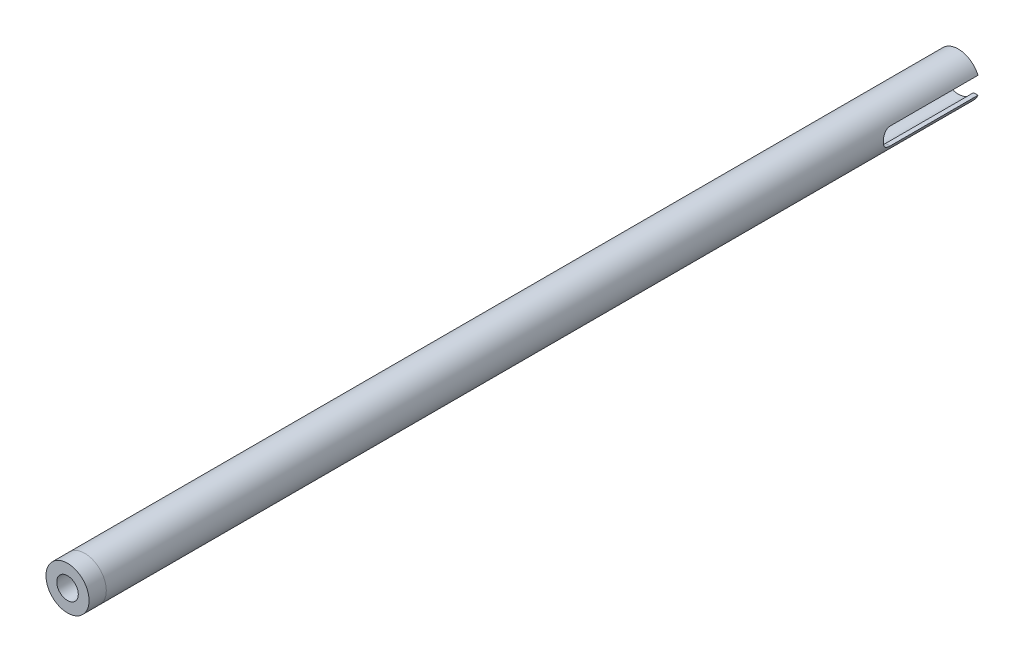
ISO-10303-21;
HEADER;
FILE_DESCRIPTION(('STEP AP214'),'2;1');
FILE_NAME('part.step','',(''),(''),'','','');
FILE_SCHEMA(('AUTOMOTIVE_DESIGN { 1 0 10303 214 1 1 1 1 }'));
ENDSEC;
DATA;
#1=APPLICATION_CONTEXT('core data for automotive mechanical design processes');
#2=APPLICATION_PROTOCOL_DEFINITION('international standard','automotive_design',2000,#1);
#3=PRODUCT_CONTEXT('',#1,'mechanical');
#4=PRODUCT('Part','Part','',(#3));
#5=PRODUCT_RELATED_PRODUCT_CATEGORY('part','',(#4));
#6=PRODUCT_DEFINITION_FORMATION('','',#4);
#7=PRODUCT_DEFINITION_CONTEXT('part definition',#1,'design');
#8=PRODUCT_DEFINITION('design','',#6,#7);
#9=PRODUCT_DEFINITION_SHAPE('','',#8);
#10=(LENGTH_UNIT() NAMED_UNIT(*) SI_UNIT(.MILLI.,.METRE.));
#11=(NAMED_UNIT(*) PLANE_ANGLE_UNIT() SI_UNIT($,.RADIAN.));
#12=(NAMED_UNIT(*) SI_UNIT($,.STERADIAN.) SOLID_ANGLE_UNIT());
#13=UNCERTAINTY_MEASURE_WITH_UNIT(LENGTH_MEASURE(1.E-05),#10,'distance_accuracy_value','');
#14=(GEOMETRIC_REPRESENTATION_CONTEXT(3) GLOBAL_UNCERTAINTY_ASSIGNED_CONTEXT((#13)) GLOBAL_UNIT_ASSIGNED_CONTEXT((#10,
#11,#12)) REPRESENTATION_CONTEXT('',''));
#15=CARTESIAN_POINT('',(0.,0.,0.));
#16=DIRECTION('',(0.,0.,1.));
#17=DIRECTION('',(1.,0.,0.));
#18=AXIS2_PLACEMENT_3D('',#15,#16,#17);
#19=CARTESIAN_POINT('',(0.,0.,-328.070249741066));
#20=DIRECTION('',(0.,0.,1.));
#21=DIRECTION('',(1.,0.,0.));
#22=AXIS2_PLACEMENT_3D('',#19,#20,#21);
#23=CYLINDRICAL_SURFACE('',#22,7.9375);
#24=CARTESIAN_POINT('',(0.,0.,-6.35));
#25=DIRECTION('',(0.,0.,1.));
#26=DIRECTION('',(1.,0.,0.));
#27=AXIS2_PLACEMENT_3D('',#24,#25,#26);
#28=CIRCLE('',#27,7.9375);
#29=CARTESIAN_POINT('',(7.9375,0.,-6.35));
#30=VERTEX_POINT('',#29);
#31=EDGE_CURVE('E167',#30,#30,#28,.T.);
#32=ORIENTED_EDGE('',*,*,#31,.F.);
#33=EDGE_LOOP('',(#32));
#34=FACE_BOUND('',#33,.T.);
#35=CARTESIAN_POINT('',(-7.2748389157424,3.175,-295.685249741066));
#36=CARTESIAN_POINT('',(-7.27482137043434,3.17501267173453,-295.599829625584));
#37=CARTESIAN_POINT('',(-7.27634297592672,3.17155313247793,-295.514419096021));
#38=CARTESIAN_POINT('',(-7.28233338484875,3.15778866907725,-295.344287091693));
#39=CARTESIAN_POINT('',(-7.28680106535325,3.14748635311323,-295.259565366834));
#40=CARTESIAN_POINT('',(-7.29852916312671,3.12019002880162,-295.091751667025));
#41=CARTESIAN_POINT('',(-7.30577831906487,3.10322299732751,-295.008654522266));
#42=CARTESIAN_POINT('',(-7.32282161153745,3.06278779397034,-294.844343420241));
#43=CARTESIAN_POINT('',(-7.33261590324725,3.03931922568674,-294.763129578127));
#44=CARTESIAN_POINT('',(-7.36535331460444,2.95952924342962,-294.523304755545));
#45=CARTESIAN_POINT('',(-7.39167595677839,2.89376893609239,-294.368179826741));
#46=CARTESIAN_POINT('',(-7.45033259991547,2.73920602658923,-294.07109240003));
#47=CARTESIAN_POINT('',(-7.48267254395243,2.65038060922872,-293.929143124812));
#48=CARTESIAN_POINT('',(-7.55175295441386,2.44684429809695,-293.654422355292));
#49=CARTESIAN_POINT('',(-7.58863404630154,2.33103943595689,-293.52249497078));
#50=CARTESIAN_POINT('',(-7.66147718953598,2.07914562663536,-293.279332087148));
#51=CARTESIAN_POINT('',(-7.69743902899202,1.94305205135848,-293.168101322221));
#52=CARTESIAN_POINT('',(-7.76611692840651,1.6477828266442,-292.965180122725));
#53=CARTESIAN_POINT('',(-7.79864638434712,1.48790317306357,-292.874445711321));
#54=CARTESIAN_POINT('',(-7.85502980346525,1.15369615984565,-292.721588157904));
#55=CARTESIAN_POINT('',(-7.87889360585224,0.979385463602728,-292.659432545287));
#56=CARTESIAN_POINT('',(-7.91022225039827,0.670405323433351,-292.578920901631));
#57=CARTESIAN_POINT('',(-7.92038443902171,0.537888188660434,-292.553242978221));
#58=CARTESIAN_POINT('',(-7.93061686811603,0.337231082382101,-292.52748789514));
#59=CARTESIAN_POINT('',(-7.93319257341971,0.269991647180293,-292.521029797859));
#60=CARTESIAN_POINT('',(-7.93663621925193,0.135173873369594,-292.512408780107));
#61=CARTESIAN_POINT('',(-7.93750363389236,0.0675954368175856,-292.510247182289));
#62=CARTESIAN_POINT('',(-7.9375,0.,-292.510249741066));
#63=B_SPLINE_CURVE_WITH_KNOTS('',3,(#35,#36,#37,#38,#39,#40,#41,#42,#43,#44,#45,#46,#47,#48,#49,
#50,#51,#52,#53,#54,#55,#56,#57,#58,#59,#60,#61,#62),.UNSPECIFIED.,.F.,.F.,(4,2,2,2,2,2,2,2,2,2,
2,2,2,4),(0.,0.256160797396612,0.512224013007114,0.767261264672295,1.02231406945471,
1.53142416248594,2.04103978047897,2.57679273649398,3.11266809162683,3.6699113602974,
4.22651992730645,4.63134321412667,4.8339937586662,5.03670667834028),.UNSPECIFIED.);
#64=CARTESIAN_POINT('',(-7.2748389157424,3.175,-295.685249741066));
#65=VERTEX_POINT('',#64);
#66=CARTESIAN_POINT('',(-7.9375,0.,-292.510249741066));
#67=VERTEX_POINT('',#66);
#68=EDGE_CURVE('E194',#65,#67,#63,.T.);
#69=ORIENTED_EDGE('',*,*,#68,.T.);
#70=CARTESIAN_POINT('',(-7.9375,0.,-292.510249741066));
#71=CARTESIAN_POINT('',(-7.93751279435796,-0.0856973243893184,-292.510237710897));
#72=CARTESIAN_POINT('',(-7.93611246860092,-0.171386675169292,-292.513719078369));
#73=CARTESIAN_POINT('',(-7.93058107051394,-0.342092796869088,-292.527575173704));
#74=CARTESIAN_POINT('',(-7.92645080745519,-0.427109759557718,-292.537947858687));
#75=CARTESIAN_POINT('',(-7.91557399086504,-0.595570690948314,-292.565445052755));
#76=CARTESIAN_POINT('',(-7.90883664469869,-0.679019123580001,-292.582545804028));
#77=CARTESIAN_POINT('',(-7.89293284658536,-0.844038966454637,-292.623313051501));
#78=CARTESIAN_POINT('',(-7.88376629739099,-0.925610301410299,-292.646979810558));
#79=CARTESIAN_POINT('',(-7.8529700783248,-1.16656173687588,-292.727487466256));
#80=CARTESIAN_POINT('',(-7.82802544143957,-1.3224472028299,-292.793880099133));
#81=CARTESIAN_POINT('',(-7.77174407779742,-1.62081902572889,-292.949925503126));
#82=CARTESIAN_POINT('',(-7.74040257287306,-1.76329524966531,-293.039595675189));
#83=CARTESIAN_POINT('',(-7.67287736621953,-2.03755465224644,-293.244049282705));
#84=CARTESIAN_POINT('',(-7.63654472176442,-2.16862853615059,-293.359736139436));
#85=CARTESIAN_POINT('',(-7.56380976030912,-2.4101102261282,-293.611030241145));
#86=CARTESIAN_POINT('',(-7.52740741976911,-2.52050895891189,-293.746646185628));
#87=CARTESIAN_POINT('',(-7.45683282624283,-2.72240939900243,-294.041344680494));
#88=CARTESIAN_POINT('',(-7.4228346735038,-2.81283701743191,-294.201208670409));
#89=CARTESIAN_POINT('',(-7.36333622196319,-2.96511894168389,-294.535334635206));
#90=CARTESIAN_POINT('',(-7.33782422493328,-3.02701262758154,-294.709576372965));
#91=CARTESIAN_POINT('',(-7.30424985403508,-3.10695047193342,-295.017880097616));
#92=CARTESIAN_POINT('',(-7.29331360019113,-3.13238569878909,-295.149738858502));
#93=CARTESIAN_POINT('',(-7.28227977674291,-3.15790858319,-295.349455740196));
#94=CARTESIAN_POINT('',(-7.27949685702346,-3.16431127275806,-295.416404030956));
#95=CARTESIAN_POINT('',(-7.27577355567174,-3.17285909036155,-295.550645588822));
#96=CARTESIAN_POINT('',(-7.27483380475762,-3.1750027609968,-295.61793896612));
#97=CARTESIAN_POINT('',(-7.2748389157424,-3.175,-295.685249741066));
#98=B_SPLINE_CURVE_WITH_KNOTS('',3,(#70,#71,#72,#73,#74,#75,#76,#77,#78,#79,#80,#81,#82,#83,#84,
#85,#86,#87,#88,#89,#90,#91,#92,#93,#94,#95,#96,#97),.UNSPECIFIED.,.F.,.F.,(4,2,2,2,2,2,2,2,2,2,
2,2,2,4),(0.,0.256996432008007,0.513916713336978,0.769937797705373,1.02596913282157,
1.53722547809955,2.04886511530059,2.58219314099272,3.11575467201799,3.67332953074268,
4.2301325519037,4.63306130520176,4.8348500382744,5.03670780985613),.UNSPECIFIED.);
#99=CARTESIAN_POINT('',(-7.2748389157424,-3.175,-295.685249741066));
#100=VERTEX_POINT('',#99);
#101=EDGE_CURVE('E146',#67,#100,#98,.T.);
#102=ORIENTED_EDGE('',*,*,#101,.T.);
#103=DIRECTION('',(0.,0.,-1.));
#104=VECTOR('',#103,1.);
#105=CARTESIAN_POINT('',(-7.2748389157424,-3.175,-292.510249741066));
#106=LINE('',#105,#104);
#107=CARTESIAN_POINT('',(-7.2748389157424,-3.175,-328.070249741066));
#108=VERTEX_POINT('',#107);
#109=EDGE_CURVE('E141',#100,#108,#106,.T.);
#110=ORIENTED_EDGE('',*,*,#109,.T.);
#111=CARTESIAN_POINT('',(0.,0.,-328.070249741066));
#112=DIRECTION('',(0.,0.,1.));
#113=DIRECTION('',(1.,0.,0.));
#114=AXIS2_PLACEMENT_3D('',#111,#112,#113);
#115=CIRCLE('',#114,7.9375);
#116=CARTESIAN_POINT('',(7.2748389157424,-3.175,-328.070249741066));
#117=VERTEX_POINT('',#116);
#118=EDGE_CURVE('E144',#108,#117,#115,.T.);
#119=ORIENTED_EDGE('',*,*,#118,.T.);
#120=DIRECTION('',(0.,0.,-1.));
#121=VECTOR('',#120,1.);
#122=CARTESIAN_POINT('',(7.2748389157424,-3.175,-292.510249741066));
#123=LINE('',#122,#121);
#124=CARTESIAN_POINT('',(7.2748389157424,-3.175,-295.685249741066));
#125=VERTEX_POINT('',#124);
#126=EDGE_CURVE('E427',#125,#117,#123,.T.);
#127=ORIENTED_EDGE('',*,*,#126,.F.);
#128=CARTESIAN_POINT('',(7.2748389157424,-3.175,-295.685249741066));
#129=CARTESIAN_POINT('',(7.27482137043434,-3.17501267173453,-295.599829625584));
#130=CARTESIAN_POINT('',(7.27634297592672,-3.17155313247793,-295.514419096021));
#131=CARTESIAN_POINT('',(7.28233338484875,-3.15778866907725,-295.344287091693));
#132=CARTESIAN_POINT('',(7.28680106535325,-3.14748635311323,-295.259565366834));
#133=CARTESIAN_POINT('',(7.29852916312671,-3.12019002880162,-295.091751667025));
#134=CARTESIAN_POINT('',(7.30577831906487,-3.10322299732751,-295.008654522266));
#135=CARTESIAN_POINT('',(7.32282161153745,-3.06278779397034,-294.844343420241));
#136=CARTESIAN_POINT('',(7.33261590324725,-3.03931922568674,-294.763129578127));
#137=CARTESIAN_POINT('',(7.36535331460444,-2.95952924342962,-294.523304755545));
#138=CARTESIAN_POINT('',(7.39167595677839,-2.89376893609239,-294.368179826741));
#139=CARTESIAN_POINT('',(7.45033259991547,-2.73920602658923,-294.07109240003));
#140=CARTESIAN_POINT('',(7.48267254395243,-2.65038060922872,-293.929143124812));
#141=CARTESIAN_POINT('',(7.55175295441386,-2.44684429809695,-293.654422355292));
#142=CARTESIAN_POINT('',(7.58863404630154,-2.33103943595689,-293.52249497078));
#143=CARTESIAN_POINT('',(7.66147718953598,-2.07914562663536,-293.279332087148));
#144=CARTESIAN_POINT('',(7.69743902899202,-1.94305205135848,-293.168101322221));
#145=CARTESIAN_POINT('',(7.76611692840651,-1.6477828266442,-292.965180122725));
#146=CARTESIAN_POINT('',(7.79864638434712,-1.48790317306357,-292.874445711321));
#147=CARTESIAN_POINT('',(7.85502980346525,-1.15369615984565,-292.721588157904));
#148=CARTESIAN_POINT('',(7.87889360585224,-0.979385463602728,-292.659432545287));
#149=CARTESIAN_POINT('',(7.91022225039827,-0.670405323433351,-292.578920901631));
#150=CARTESIAN_POINT('',(7.92038443902171,-0.537888188660434,-292.553242978221));
#151=CARTESIAN_POINT('',(7.93061686811603,-0.337231082382101,-292.52748789514));
#152=CARTESIAN_POINT('',(7.93319257341971,-0.269991647180293,-292.521029797859));
#153=CARTESIAN_POINT('',(7.93663621925193,-0.135173873369594,-292.512408780107));
#154=CARTESIAN_POINT('',(7.93750363389236,-0.0675954368175856,-292.510247182289));
#155=CARTESIAN_POINT('',(7.9375,0.,-292.510249741066));
#156=B_SPLINE_CURVE_WITH_KNOTS('',3,(#128,#129,#130,#131,#132,#133,#134,#135,#136,#137,#138,
#139,#140,#141,#142,#143,#144,#145,#146,#147,#148,#149,#150,#151,#152,#153,#154,#155),
.UNSPECIFIED.,.F.,.F.,(4,2,2,2,2,2,2,2,2,2,2,2,2,4),(0.,0.256160797396612,0.512224013007114,
0.767261264672295,1.02231406945471,1.53142416248594,2.04103978047897,2.57679273649398,
3.11266809162683,3.6699113602974,4.22651992730645,4.63134321412667,4.8339937586662,
5.03670667834028),.UNSPECIFIED.);
#157=CARTESIAN_POINT('',(7.9375,0.,-292.510249741066));
#158=VERTEX_POINT('',#157);
#159=EDGE_CURVE('E87',#125,#158,#156,.T.);
#160=ORIENTED_EDGE('',*,*,#159,.T.);
#161=CARTESIAN_POINT('',(7.9375,0.,-292.510249741066));
#162=CARTESIAN_POINT('',(7.93751279435796,0.0856973243893184,-292.510237710897));
#163=CARTESIAN_POINT('',(7.93611246860092,0.171386675169292,-292.513719078369));
#164=CARTESIAN_POINT('',(7.93058107051394,0.342092796869088,-292.527575173704));
#165=CARTESIAN_POINT('',(7.92645080745519,0.427109759557718,-292.537947858687));
#166=CARTESIAN_POINT('',(7.91557399086504,0.595570690948314,-292.565445052755));
#167=CARTESIAN_POINT('',(7.90883664469869,0.679019123580001,-292.582545804028));
#168=CARTESIAN_POINT('',(7.89293284658536,0.844038966454637,-292.623313051501));
#169=CARTESIAN_POINT('',(7.88376629739099,0.925610301410299,-292.646979810558));
#170=CARTESIAN_POINT('',(7.8529700783248,1.16656173687588,-292.727487466256));
#171=CARTESIAN_POINT('',(7.82802544143957,1.3224472028299,-292.793880099133));
#172=CARTESIAN_POINT('',(7.77174407779742,1.62081902572889,-292.949925503126));
#173=CARTESIAN_POINT('',(7.74040257287306,1.76329524966531,-293.039595675189));
#174=CARTESIAN_POINT('',(7.67287736621953,2.03755465224644,-293.244049282705));
#175=CARTESIAN_POINT('',(7.63654472176442,2.16862853615059,-293.359736139436));
#176=CARTESIAN_POINT('',(7.56380976030912,2.4101102261282,-293.611030241145));
#177=CARTESIAN_POINT('',(7.52740741976911,2.52050895891189,-293.746646185628));
#178=CARTESIAN_POINT('',(7.45683282624283,2.72240939900243,-294.041344680494));
#179=CARTESIAN_POINT('',(7.4228346735038,2.81283701743191,-294.201208670409));
#180=CARTESIAN_POINT('',(7.36333622196319,2.96511894168389,-294.535334635206));
#181=CARTESIAN_POINT('',(7.33782422493328,3.02701262758154,-294.709576372965));
#182=CARTESIAN_POINT('',(7.30424985403508,3.10695047193342,-295.017880097616));
#183=CARTESIAN_POINT('',(7.29331360019113,3.13238569878909,-295.149738858502));
#184=CARTESIAN_POINT('',(7.28227977674291,3.15790858319,-295.349455740196));
#185=CARTESIAN_POINT('',(7.27949685702346,3.16431127275806,-295.416404030956));
#186=CARTESIAN_POINT('',(7.27577355567174,3.17285909036155,-295.550645588822));
#187=CARTESIAN_POINT('',(7.27483380475762,3.1750027609968,-295.61793896612));
#188=CARTESIAN_POINT('',(7.2748389157424,3.175,-295.685249741066));
#189=B_SPLINE_CURVE_WITH_KNOTS('',3,(#161,#162,#163,#164,#165,#166,#167,#168,#169,#170,#171,
#172,#173,#174,#175,#176,#177,#178,#179,#180,#181,#182,#183,#184,#185,#186,#187,#188),
.UNSPECIFIED.,.F.,.F.,(4,2,2,2,2,2,2,2,2,2,2,2,2,4),(0.,0.256996432008007,0.513916713336978,
0.769937797705373,1.02596913282157,1.53722547809955,2.04886511530059,2.58219314099272,
3.11575467201799,3.67332953074268,4.2301325519037,4.63306130520176,4.8348500382744,
5.03670780985613),.UNSPECIFIED.);
#190=CARTESIAN_POINT('',(7.2748389157424,3.175,-295.685249741066));
#191=VERTEX_POINT('',#190);
#192=EDGE_CURVE('E73',#158,#191,#189,.T.);
#193=ORIENTED_EDGE('',*,*,#192,.T.);
#194=DIRECTION('',(0.,0.,-1.));
#195=VECTOR('',#194,1.);
#196=CARTESIAN_POINT('',(7.2748389157424,3.175,-292.510249741066));
#197=LINE('',#196,#195);
#198=CARTESIAN_POINT('',(7.2748389157424,3.175,-328.070249741066));
#199=VERTEX_POINT('',#198);
#200=EDGE_CURVE('E160',#191,#199,#197,.T.);
#201=ORIENTED_EDGE('',*,*,#200,.T.);
#202=CARTESIAN_POINT('',(-7.2748389157424,3.175,-328.070249741066));
#203=VERTEX_POINT('',#202);
#204=EDGE_CURVE('E166',#199,#203,#115,.T.);
#205=ORIENTED_EDGE('',*,*,#204,.T.);
#206=DIRECTION('',(0.,0.,-1.));
#207=VECTOR('',#206,1.);
#208=CARTESIAN_POINT('',(-7.2748389157424,3.175,-292.510249741066));
#209=LINE('',#208,#207);
#210=EDGE_CURVE('E420',#65,#203,#209,.T.);
#211=ORIENTED_EDGE('',*,*,#210,.F.);
#212=EDGE_LOOP('',(#69,#102,#110,#119,#127,#160,#193,#201,#205,#211));
#213=FACE_BOUND('',#212,.T.);
#214=ADVANCED_FACE('F63',(#34,#213),#23,.T.);
#215=CARTESIAN_POINT('',(0.,0.,-328.070249741066));
#216=DIRECTION('',(0.,0.,1.));
#217=DIRECTION('',(1.,0.,0.));
#218=AXIS2_PLACEMENT_3D('',#215,#216,#217);
#219=PLANE('',#218);
#220=DIRECTION('',(1.,0.,0.));
#221=VECTOR('',#220,1.);
#222=CARTESIAN_POINT('',(0.,-3.175,-328.070249741066));
#223=LINE('',#222,#221);
#224=CARTESIAN_POINT('',(-5.63085690548073,-3.175,-328.070249741066));
#225=VERTEX_POINT('',#224);
#226=EDGE_CURVE('E153',#108,#225,#223,.T.);
#227=ORIENTED_EDGE('',*,*,#226,.T.);
#228=CARTESIAN_POINT('',(0.,0.,-328.070249741066));
#229=DIRECTION('',(0.,0.,1.));
#230=DIRECTION('',(1.,0.,0.));
#231=AXIS2_PLACEMENT_3D('',#228,#229,#230);
#232=CIRCLE('',#231,6.4643);
#233=CARTESIAN_POINT('',(5.63085690548073,-3.175,-328.070249741066));
#234=VERTEX_POINT('',#233);
#235=EDGE_CURVE('E275',#225,#234,#232,.T.);
#236=ORIENTED_EDGE('',*,*,#235,.T.);
#237=DIRECTION('',(1.,0.,0.));
#238=VECTOR('',#237,1.);
#239=CARTESIAN_POINT('',(0.,-3.175,-328.070249741066));
#240=LINE('',#239,#238);
#241=EDGE_CURVE('E165',#234,#117,#240,.T.);
#242=ORIENTED_EDGE('',*,*,#241,.T.);
#243=ORIENTED_EDGE('',*,*,#118,.F.);
#244=EDGE_LOOP('',(#227,#236,#242,#243));
#245=FACE_BOUND('',#244,.T.);
#246=ADVANCED_FACE('F163',(#245),#219,.F.);
#247=CARTESIAN_POINT('',(0.,0.,-328.070249741066));
#248=DIRECTION('',(0.,0.,1.));
#249=DIRECTION('',(1.,0.,0.));
#250=AXIS2_PLACEMENT_3D('',#247,#248,#249);
#251=CYLINDRICAL_SURFACE('',#250,6.4643);
#252=CARTESIAN_POINT('',(0.,0.,-6.35));
#253=DIRECTION('',(0.,0.,1.));
#254=DIRECTION('',(1.,0.,0.));
#255=AXIS2_PLACEMENT_3D('',#252,#253,#254);
#256=CIRCLE('',#255,6.4643);
#257=CARTESIAN_POINT('',(6.4643,0.,-6.35));
#258=VERTEX_POINT('',#257);
#259=EDGE_CURVE('E149',#258,#258,#256,.T.);
#260=ORIENTED_EDGE('',*,*,#259,.T.);
#261=EDGE_LOOP('',(#260));
#262=FACE_BOUND('',#261,.T.);
#263=DIRECTION('',(0.,0.,-1.));
#264=VECTOR('',#263,1.);
#265=CARTESIAN_POINT('',(-5.63085690548073,-3.175,-292.510249741066));
#266=LINE('',#265,#264);
#267=CARTESIAN_POINT('',(-5.63085690548073,-3.175,-295.685249741066));
#268=VERTEX_POINT('',#267);
#269=EDGE_CURVE('E150',#268,#225,#266,.T.);
#270=ORIENTED_EDGE('',*,*,#269,.F.);
#271=CARTESIAN_POINT('',(-5.63085690548073,-3.175,-295.685249741066));
#272=CARTESIAN_POINT('',(-5.63083313994649,-3.17501475983035,-295.601872906346));
#273=CARTESIAN_POINT('',(-5.63270815771784,-3.17171623434453,-295.518509231177));
#274=CARTESIAN_POINT('',(-5.64007695954704,-3.15860868668088,-295.352504089081));
#275=CARTESIAN_POINT('',(-5.64556860910801,-3.14880350463521,-295.269862225282));
#276=CARTESIAN_POINT('',(-5.6599516035627,-3.12287177657853,-295.106358960612));
#277=CARTESIAN_POINT('',(-5.6688236064135,-3.10678118209034,-295.025490148432));
#278=CARTESIAN_POINT('',(-5.6896425308495,-3.06848763641646,-294.865632768705));
#279=CARTESIAN_POINT('',(-5.70158978762268,-3.04628401892209,-294.786644407145));
#280=CARTESIAN_POINT('',(-5.74141867016874,-2.9709479042579,-294.553586161184));
#281=CARTESIAN_POINT('',(-5.77333273238342,-2.90901346570841,-294.40294962055));
#282=CARTESIAN_POINT('',(-5.84425759514897,-2.763754188191,-294.114094515716));
#283=CARTESIAN_POINT('',(-5.88327925344641,-2.68039654138926,-293.975895440652));
#284=CARTESIAN_POINT('',(-5.96775435279506,-2.48697819565356,-293.703954402413));
#285=CARTESIAN_POINT('',(-6.01347229172613,-2.37533204038059,-293.571419596064));
#286=CARTESIAN_POINT('',(-6.1040459306363,-2.13182339161098,-293.326044012986));
#287=CARTESIAN_POINT('',(-6.14890136897124,-1.9999548691305,-293.213209131008));
#288=CARTESIAN_POINT('',(-6.23619220514827,-1.70925564842441,-293.003225747087));
#289=CARTESIAN_POINT('',(-6.27828027392068,-1.54922894444793,-292.907575471358));
#290=CARTESIAN_POINT('',(-6.351789494002,-1.21302302470908,-292.745191566141));
#291=CARTESIAN_POINT('',(-6.3832266631188,-1.03686857473503,-292.678414472337));
#292=CARTESIAN_POINT('',(-6.42590822780063,-0.717171909263576,-292.588981825029));
#293=CARTESIAN_POINT('',(-6.4401838278065,-0.575906031157532,-292.559593580107));
#294=CARTESIAN_POINT('',(-6.45458743188517,-0.361448476439112,-292.530060860445));
#295=CARTESIAN_POINT('',(-6.45822048728408,-0.289432204318667,-292.522641415684));
#296=CARTESIAN_POINT('',(-6.46308007773031,-0.14495205029204,-292.512732943524));
#297=CARTESIAN_POINT('',(-6.46430565210199,-0.0724880012715136,-292.510245884329));
#298=CARTESIAN_POINT('',(-6.4643,0.,-292.510249741066));
#299=B_SPLINE_CURVE_WITH_KNOTS('',3,(#271,#272,#273,#274,#275,#276,#277,#278,#279,#280,#281,
#282,#283,#284,#285,#286,#287,#288,#289,#290,#291,#292,#293,#294,#295,#296,#297,#298),
.UNSPECIFIED.,.F.,.F.,(4,2,2,2,2,2,2,2,2,2,2,2,2,4),(0.,0.250022608278555,0.499897788004003,
0.748364171658997,0.996857648438736,1.49241740389683,1.98874063697391,2.52413245916952,
3.05968421153491,3.63008006190818,4.19961425046545,4.63293550793411,4.85021333970384,
5.06757785591817),.UNSPECIFIED.);
#300=CARTESIAN_POINT('',(-6.4643,0.,-292.510249741066));
#301=VERTEX_POINT('',#300);
#302=EDGE_CURVE('E221',#268,#301,#299,.T.);
#303=ORIENTED_EDGE('',*,*,#302,.T.);
#304=CARTESIAN_POINT('',(-6.4643,0.,-292.510249741066));
#305=CARTESIAN_POINT('',(-6.46431471784482,0.0839947643435512,-292.51023639694));
#306=CARTESIAN_POINT('',(-6.46266329267846,0.1679801280104,-292.513582496309));
#307=CARTESIAN_POINT('',(-6.45613851930725,0.33526707084789,-292.526889949912));
#308=CARTESIAN_POINT('',(-6.45126643524264,0.418568905327652,-292.53684870862));
#309=CARTESIAN_POINT('',(-6.4384393661228,0.583520093709594,-292.563218751089));
#310=CARTESIAN_POINT('',(-6.43049830091841,0.66517518191479,-292.579600905337));
#311=CARTESIAN_POINT('',(-6.41174605062734,0.826621713408843,-292.618618445091));
#312=CARTESIAN_POINT('',(-6.40093469346324,0.906413044651109,-292.641254205511));
#313=CARTESIAN_POINT('',(-6.3645999533627,1.14200454475575,-292.718153769603));
#314=CARTESIAN_POINT('',(-6.33514826225986,1.29435730209624,-292.781464402786));
#315=CARTESIAN_POINT('',(-6.26847721301059,1.58615012370468,-292.929955902616));
#316=CARTESIAN_POINT('',(-6.23125016174678,1.72557720024459,-293.015158448982));
#317=CARTESIAN_POINT('',(-6.14993667819984,1.99664965861334,-293.210672395111));
#318=CARTESIAN_POINT('',(-6.10557667432165,2.12736555519216,-293.322159254762));
#319=CARTESIAN_POINT('',(-6.01591119010694,2.36910305567937,-293.564561677944));
#320=CARTESIAN_POINT('',(-5.97060501254448,2.48010951928959,-293.69549203693));
#321=CARTESIAN_POINT('',(-5.88028635793905,2.68759195973765,-293.984814375673));
#322=CARTESIAN_POINT('',(-5.83554983812279,2.78235777578918,-294.144528478326));
#323=CARTESIAN_POINT('',(-5.75613746809778,2.94315382396594,-294.479879722902));
#324=CARTESIAN_POINT('',(-5.72144095718824,3.00924320962384,-294.655483174756));
#325=CARTESIAN_POINT('',(-5.67404956693615,3.09744900867388,-294.973487476442));
#326=CARTESIAN_POINT('',(-5.65804978215016,3.1263652160224,-295.113512166384));
#327=CARTESIAN_POINT('',(-5.64184153899281,3.1554574998571,-295.326260464995));
#328=CARTESIAN_POINT('',(-5.63773701667687,3.16277482388529,-295.397770353099));
#329=CARTESIAN_POINT('',(-5.63223913004552,3.17254960488947,-295.54126141487));
#330=CARTESIAN_POINT('',(-5.6308471601211,3.17500456237039,-295.613242811851));
#331=CARTESIAN_POINT('',(-5.63085690548073,3.175,-295.685249741066));
#332=B_SPLINE_CURVE_WITH_KNOTS('',3,(#304,#305,#306,#307,#308,#309,#310,#311,#312,#313,#314,
#315,#316,#317,#318,#319,#320,#321,#322,#323,#324,#325,#326,#327,#328,#329,#330,#331),
.UNSPECIFIED.,.F.,.F.,(4,2,2,2,2,2,2,2,2,2,2,2,2,4),(0.,0.25188580168802,0.503672794384377,
0.754330922106993,1.00500408047846,1.50534146760877,2.00617626510683,2.53624961383844,
3.06672840649523,3.63692439554961,4.20593853113138,4.63586569132649,4.85167139809479,
5.06758801082739),.UNSPECIFIED.);
#333=CARTESIAN_POINT('',(-5.63085690548073,3.175,-295.685249741066));
#334=VERTEX_POINT('',#333);
#335=EDGE_CURVE('E186',#301,#334,#332,.T.);
#336=ORIENTED_EDGE('',*,*,#335,.T.);
#337=DIRECTION('',(0.,0.,-1.));
#338=VECTOR('',#337,1.);
#339=CARTESIAN_POINT('',(-5.63085690548073,3.175,-292.510249741066));
#340=LINE('',#339,#338);
#341=CARTESIAN_POINT('',(-5.63085690548073,3.175,-328.070249741066));
#342=VERTEX_POINT('',#341);
#343=EDGE_CURVE('E417',#334,#342,#340,.T.);
#344=ORIENTED_EDGE('',*,*,#343,.T.);
#345=CARTESIAN_POINT('',(5.63085690548073,3.175,-328.070249741066));
#346=VERTEX_POINT('',#345);
#347=EDGE_CURVE('E172',#346,#342,#232,.T.);
#348=ORIENTED_EDGE('',*,*,#347,.F.);
#349=DIRECTION('',(0.,0.,-1.));
#350=VECTOR('',#349,1.);
#351=CARTESIAN_POINT('',(5.63085690548073,3.175,-292.510249741066));
#352=LINE('',#351,#350);
#353=CARTESIAN_POINT('',(5.63085690548073,3.175,-295.685249741066));
#354=VERTEX_POINT('',#353);
#355=EDGE_CURVE('E269',#354,#346,#352,.T.);
#356=ORIENTED_EDGE('',*,*,#355,.F.);
#357=CARTESIAN_POINT('',(5.63085690548073,3.175,-295.685249741066));
#358=CARTESIAN_POINT('',(5.63083313994649,3.17501475983035,-295.601872906346));
#359=CARTESIAN_POINT('',(5.63270815771784,3.17171623434453,-295.518509231177));
#360=CARTESIAN_POINT('',(5.64007695954704,3.15860868668088,-295.352504089081));
#361=CARTESIAN_POINT('',(5.64556860910801,3.14880350463521,-295.269862225282));
#362=CARTESIAN_POINT('',(5.6599516035627,3.12287177657853,-295.106358960612));
#363=CARTESIAN_POINT('',(5.6688236064135,3.10678118209034,-295.025490148432));
#364=CARTESIAN_POINT('',(5.6896425308495,3.06848763641646,-294.865632768705));
#365=CARTESIAN_POINT('',(5.70158978762268,3.04628401892209,-294.786644407145));
#366=CARTESIAN_POINT('',(5.74141867016874,2.9709479042579,-294.553586161184));
#367=CARTESIAN_POINT('',(5.77333273238342,2.90901346570841,-294.40294962055));
#368=CARTESIAN_POINT('',(5.84425759514897,2.763754188191,-294.114094515716));
#369=CARTESIAN_POINT('',(5.88327925344641,2.68039654138926,-293.975895440652));
#370=CARTESIAN_POINT('',(5.96775435279506,2.48697819565356,-293.703954402413));
#371=CARTESIAN_POINT('',(6.01347229172613,2.37533204038059,-293.571419596064));
#372=CARTESIAN_POINT('',(6.1040459306363,2.13182339161098,-293.326044012986));
#373=CARTESIAN_POINT('',(6.14890136897124,1.9999548691305,-293.213209131008));
#374=CARTESIAN_POINT('',(6.23619220514827,1.70925564842441,-293.003225747087));
#375=CARTESIAN_POINT('',(6.27828027392068,1.54922894444793,-292.907575471358));
#376=CARTESIAN_POINT('',(6.351789494002,1.21302302470908,-292.745191566141));
#377=CARTESIAN_POINT('',(6.3832266631188,1.03686857473503,-292.678414472337));
#378=CARTESIAN_POINT('',(6.42590822780063,0.717171909263576,-292.588981825029));
#379=CARTESIAN_POINT('',(6.4401838278065,0.575906031157532,-292.559593580107));
#380=CARTESIAN_POINT('',(6.45458743188517,0.361448476439112,-292.530060860445));
#381=CARTESIAN_POINT('',(6.45822048728408,0.289432204318667,-292.522641415684));
#382=CARTESIAN_POINT('',(6.46308007773031,0.14495205029204,-292.512732943524));
#383=CARTESIAN_POINT('',(6.46430565210199,0.0724880012715136,-292.510245884329));
#384=CARTESIAN_POINT('',(6.4643,0.,-292.510249741066));
#385=B_SPLINE_CURVE_WITH_KNOTS('',3,(#357,#358,#359,#360,#361,#362,#363,#364,#365,#366,#367,
#368,#369,#370,#371,#372,#373,#374,#375,#376,#377,#378,#379,#380,#381,#382,#383,#384),
.UNSPECIFIED.,.F.,.F.,(4,2,2,2,2,2,2,2,2,2,2,2,2,4),(0.,0.250022608278555,0.499897788004003,
0.748364171658997,0.996857648438736,1.49241740389683,1.98874063697391,2.52413245916952,
3.05968421153491,3.63008006190818,4.19961425046545,4.63293550793411,4.85021333970384,
5.06757785591817),.UNSPECIFIED.);
#386=CARTESIAN_POINT('',(6.4643,0.,-292.510249741066));
#387=VERTEX_POINT('',#386);
#388=EDGE_CURVE('E13',#354,#387,#385,.T.);
#389=ORIENTED_EDGE('',*,*,#388,.T.);
#390=CARTESIAN_POINT('',(6.4643,0.,-292.510249741066));
#391=CARTESIAN_POINT('',(6.46431471784482,-0.0839947643435512,-292.51023639694));
#392=CARTESIAN_POINT('',(6.46266329267846,-0.1679801280104,-292.513582496309));
#393=CARTESIAN_POINT('',(6.45613851930725,-0.33526707084789,-292.526889949912));
#394=CARTESIAN_POINT('',(6.45126643524264,-0.418568905327652,-292.53684870862));
#395=CARTESIAN_POINT('',(6.4384393661228,-0.583520093709594,-292.563218751089));
#396=CARTESIAN_POINT('',(6.43049830091841,-0.66517518191479,-292.579600905337));
#397=CARTESIAN_POINT('',(6.41174605062734,-0.826621713408843,-292.618618445091));
#398=CARTESIAN_POINT('',(6.40093469346324,-0.906413044651109,-292.641254205511));
#399=CARTESIAN_POINT('',(6.3645999533627,-1.14200454475575,-292.718153769603));
#400=CARTESIAN_POINT('',(6.33514826225986,-1.29435730209624,-292.781464402786));
#401=CARTESIAN_POINT('',(6.26847721301059,-1.58615012370468,-292.929955902616));
#402=CARTESIAN_POINT('',(6.23125016174678,-1.72557720024459,-293.015158448982));
#403=CARTESIAN_POINT('',(6.14993667819984,-1.99664965861334,-293.210672395111));
#404=CARTESIAN_POINT('',(6.10557667432165,-2.12736555519216,-293.322159254762));
#405=CARTESIAN_POINT('',(6.01591119010694,-2.36910305567937,-293.564561677944));
#406=CARTESIAN_POINT('',(5.97060501254448,-2.48010951928959,-293.69549203693));
#407=CARTESIAN_POINT('',(5.88028635793905,-2.68759195973765,-293.984814375673));
#408=CARTESIAN_POINT('',(5.83554983812279,-2.78235777578918,-294.144528478326));
#409=CARTESIAN_POINT('',(5.75613746809778,-2.94315382396594,-294.479879722902));
#410=CARTESIAN_POINT('',(5.72144095718824,-3.00924320962384,-294.655483174756));
#411=CARTESIAN_POINT('',(5.67404956693615,-3.09744900867388,-294.973487476442));
#412=CARTESIAN_POINT('',(5.65804978215016,-3.1263652160224,-295.113512166384));
#413=CARTESIAN_POINT('',(5.64184153899281,-3.1554574998571,-295.326260464995));
#414=CARTESIAN_POINT('',(5.63773701667687,-3.16277482388529,-295.397770353099));
#415=CARTESIAN_POINT('',(5.63223913004552,-3.17254960488947,-295.54126141487));
#416=CARTESIAN_POINT('',(5.6308471601211,-3.17500456237039,-295.613242811851));
#417=CARTESIAN_POINT('',(5.63085690548073,-3.175,-295.685249741066));
#418=B_SPLINE_CURVE_WITH_KNOTS('',3,(#390,#391,#392,#393,#394,#395,#396,#397,#398,#399,#400,
#401,#402,#403,#404,#405,#406,#407,#408,#409,#410,#411,#412,#413,#414,#415,#416,#417),
.UNSPECIFIED.,.F.,.F.,(4,2,2,2,2,2,2,2,2,2,2,2,2,4),(0.,0.25188580168802,0.503672794384377,
0.754330922106993,1.00500408047846,1.50534146760877,2.00617626510683,2.53624961383844,
3.06672840649523,3.63692439554961,4.20593853113138,4.63586569132649,4.85167139809479,
5.06758801082739),.UNSPECIFIED.);
#419=CARTESIAN_POINT('',(5.63085690548073,-3.175,-295.685249741066));
#420=VERTEX_POINT('',#419);
#421=EDGE_CURVE('E237',#387,#420,#418,.T.);
#422=ORIENTED_EDGE('',*,*,#421,.T.);
#423=DIRECTION('',(0.,0.,-1.));
#424=VECTOR('',#423,1.);
#425=CARTESIAN_POINT('',(5.63085690548073,-3.175,-292.510249741066));
#426=LINE('',#425,#424);
#427=EDGE_CURVE('E271',#420,#234,#426,.T.);
#428=ORIENTED_EDGE('',*,*,#427,.T.);
#429=ORIENTED_EDGE('',*,*,#235,.F.);
#430=EDGE_LOOP('',(#270,#303,#336,#344,#348,#356,#389,#422,#428,#429));
#431=FACE_BOUND('',#430,.T.);
#432=ADVANCED_FACE('F201',(#262,#431),#251,.F.);
#433=ORIENTED_EDGE('',*,*,#347,.T.);
#434=DIRECTION('',(1.,0.,0.));
#435=VECTOR('',#434,1.);
#436=CARTESIAN_POINT('',(0.,3.175,-328.070249741066));
#437=LINE('',#436,#435);
#438=EDGE_CURVE('E159',#203,#342,#437,.T.);
#439=ORIENTED_EDGE('',*,*,#438,.F.);
#440=ORIENTED_EDGE('',*,*,#204,.F.);
#441=DIRECTION('',(1.,0.,0.));
#442=VECTOR('',#441,1.);
#443=CARTESIAN_POINT('',(0.,3.175,-328.070249741066));
#444=LINE('',#443,#442);
#445=EDGE_CURVE('E253',#346,#199,#444,.T.);
#446=ORIENTED_EDGE('',*,*,#445,.F.);
#447=EDGE_LOOP('',(#433,#439,#440,#446));
#448=FACE_BOUND('',#447,.T.);
#449=ADVANCED_FACE('F286',(#448),#219,.F.);
#450=CARTESIAN_POINT('',(0.,0.,-6.35));
#451=DIRECTION('',(0.,0.,1.));
#452=DIRECTION('',(1.,0.,0.));
#453=AXIS2_PLACEMENT_3D('',#450,#451,#452);
#454=PLANE('',#453);
#455=ORIENTED_EDGE('',*,*,#259,.F.);
#456=EDGE_LOOP('',(#455));
#457=FACE_BOUND('',#456,.T.);
#458=ORIENTED_EDGE('',*,*,#31,.T.);
#459=EDGE_LOOP('',(#458));
#460=FACE_BOUND('',#459,.T.);
#461=ADVANCED_FACE('F283',(#457,#460),#454,.T.);
#462=CARTESIAN_POINT('',(0.,3.175,-292.510249741066));
#463=DIRECTION('',(0.,1.,0.));
#464=DIRECTION('',(0.,0.,1.));
#465=AXIS2_PLACEMENT_3D('',#462,#463,#464);
#466=PLANE('',#465);
#467=ORIENTED_EDGE('',*,*,#200,.F.);
#468=DIRECTION('',(1.,0.,0.));
#469=VECTOR('',#468,1.);
#470=CARTESIAN_POINT('',(5.63085690548073,3.175,-295.685249741066));
#471=LINE('',#470,#469);
#472=EDGE_CURVE('E184',#191,#354,#471,.F.);
#473=ORIENTED_EDGE('',*,*,#472,.T.);
#474=ORIENTED_EDGE('',*,*,#355,.T.);
#475=ORIENTED_EDGE('',*,*,#445,.T.);
#476=EDGE_LOOP('',(#467,#473,#474,#475));
#477=FACE_BOUND('',#476,.T.);
#478=ADVANCED_FACE('F266',(#477),#466,.F.);
#479=CARTESIAN_POINT('',(0.,-3.175,-292.510249741066));
#480=DIRECTION('',(0.,1.,0.));
#481=DIRECTION('',(0.,0.,1.));
#482=AXIS2_PLACEMENT_3D('',#479,#480,#481);
#483=PLANE('',#482);
#484=ORIENTED_EDGE('',*,*,#427,.F.);
#485=DIRECTION('',(1.,0.,0.));
#486=VECTOR('',#485,1.);
#487=CARTESIAN_POINT('',(0.,-3.175,-295.685249741066));
#488=LINE('',#487,#486);
#489=EDGE_CURVE('E181',#420,#125,#488,.T.);
#490=ORIENTED_EDGE('',*,*,#489,.T.);
#491=ORIENTED_EDGE('',*,*,#126,.T.);
#492=ORIENTED_EDGE('',*,*,#241,.F.);
#493=EDGE_LOOP('',(#484,#490,#491,#492));
#494=FACE_BOUND('',#493,.T.);
#495=ADVANCED_FACE('F361',(#494),#483,.T.);
#496=CARTESIAN_POINT('',(0.,-3.175,-292.510249741066));
#497=DIRECTION('',(0.,1.,0.));
#498=DIRECTION('',(0.,0.,1.));
#499=AXIS2_PLACEMENT_3D('',#496,#497,#498);
#500=PLANE('',#499);
#501=ORIENTED_EDGE('',*,*,#109,.F.);
#502=DIRECTION('',(1.,0.,0.));
#503=VECTOR('',#502,1.);
#504=CARTESIAN_POINT('',(0.,-3.175,-295.685249741066));
#505=LINE('',#504,#503);
#506=EDGE_CURVE('E179',#100,#268,#505,.T.);
#507=ORIENTED_EDGE('',*,*,#506,.T.);
#508=ORIENTED_EDGE('',*,*,#269,.T.);
#509=ORIENTED_EDGE('',*,*,#226,.F.);
#510=EDGE_LOOP('',(#501,#507,#508,#509));
#511=FACE_BOUND('',#510,.T.);
#512=ADVANCED_FACE('F154',(#511),#500,.T.);
#513=CARTESIAN_POINT('',(0.,3.175,-292.510249741066));
#514=DIRECTION('',(0.,1.,0.));
#515=DIRECTION('',(0.,0.,1.));
#516=AXIS2_PLACEMENT_3D('',#513,#514,#515);
#517=PLANE('',#516);
#518=ORIENTED_EDGE('',*,*,#343,.F.);
#519=DIRECTION('',(1.,0.,0.));
#520=VECTOR('',#519,1.);
#521=CARTESIAN_POINT('',(-7.2748389157424,3.175,-295.685249741066));
#522=LINE('',#521,#520);
#523=EDGE_CURVE('E170',#334,#65,#522,.F.);
#524=ORIENTED_EDGE('',*,*,#523,.T.);
#525=ORIENTED_EDGE('',*,*,#210,.T.);
#526=ORIENTED_EDGE('',*,*,#438,.T.);
#527=EDGE_LOOP('',(#518,#524,#525,#526));
#528=FACE_BOUND('',#527,.T.);
#529=ADVANCED_FACE('F216',(#528),#517,.F.);
#530=CARTESIAN_POINT('',(0.,0.,-295.685249741066));
#531=DIRECTION('',(1.,0.,0.));
#532=DIRECTION('',(0.,0.,-1.));
#533=AXIS2_PLACEMENT_3D('',#530,#531,#532);
#534=CYLINDRICAL_SURFACE('',#533,3.175);
#535=ORIENTED_EDGE('',*,*,#506,.F.);
#536=ORIENTED_EDGE('',*,*,#101,.F.);
#537=DIRECTION('',(1.,0.,0.));
#538=VECTOR('',#537,1.);
#539=CARTESIAN_POINT('',(0.,0.,-292.510249741066));
#540=LINE('',#539,#538);
#541=EDGE_CURVE('E251',#301,#67,#540,.F.);
#542=ORIENTED_EDGE('',*,*,#541,.F.);
#543=ORIENTED_EDGE('',*,*,#302,.F.);
#544=EDGE_LOOP('',(#535,#536,#542,#543));
#545=FACE_BOUND('',#544,.T.);
#546=ADVANCED_FACE('F209',(#545),#534,.F.);
#547=CARTESIAN_POINT('',(0.,0.,-295.685249741066));
#548=DIRECTION('',(-1.,0.,0.));
#549=DIRECTION('',(0.,0.,1.));
#550=AXIS2_PLACEMENT_3D('',#547,#548,#549);
#551=CYLINDRICAL_SURFACE('',#550,3.175);
#552=ORIENTED_EDGE('',*,*,#68,.F.);
#553=ORIENTED_EDGE('',*,*,#523,.F.);
#554=ORIENTED_EDGE('',*,*,#335,.F.);
#555=ORIENTED_EDGE('',*,*,#541,.T.);
#556=EDGE_LOOP('',(#552,#553,#554,#555));
#557=FACE_BOUND('',#556,.T.);
#558=ADVANCED_FACE('F205',(#557),#551,.F.);
#559=CARTESIAN_POINT('',(0.,0.,-295.685249741066));
#560=DIRECTION('',(-1.,0.,0.));
#561=DIRECTION('',(0.,0.,1.));
#562=AXIS2_PLACEMENT_3D('',#559,#560,#561);
#563=CYLINDRICAL_SURFACE('',#562,3.175);
#564=DIRECTION('',(1.,0.,0.));
#565=VECTOR('',#564,1.);
#566=CARTESIAN_POINT('',(7.2748389157424,0.,-292.510249741066));
#567=LINE('',#566,#565);
#568=EDGE_CURVE('E68',#387,#158,#567,.T.);
#569=ORIENTED_EDGE('',*,*,#568,.F.);
#570=ORIENTED_EDGE('',*,*,#388,.F.);
#571=ORIENTED_EDGE('',*,*,#472,.F.);
#572=ORIENTED_EDGE('',*,*,#192,.F.);
#573=EDGE_LOOP('',(#569,#570,#571,#572));
#574=FACE_BOUND('',#573,.T.);
#575=ADVANCED_FACE('F65',(#574),#563,.F.);
#576=CARTESIAN_POINT('',(0.,0.,-295.685249741066));
#577=DIRECTION('',(1.,0.,0.));
#578=DIRECTION('',(0.,0.,-1.));
#579=AXIS2_PLACEMENT_3D('',#576,#577,#578);
#580=CYLINDRICAL_SURFACE('',#579,3.175);
#581=ORIENTED_EDGE('',*,*,#421,.F.);
#582=ORIENTED_EDGE('',*,*,#568,.T.);
#583=ORIENTED_EDGE('',*,*,#159,.F.);
#584=ORIENTED_EDGE('',*,*,#489,.F.);
#585=EDGE_LOOP('',(#581,#582,#583,#584));
#586=FACE_BOUND('',#585,.T.);
#587=ADVANCED_FACE('F218',(#586),#580,.F.);
#588=CLOSED_SHELL('',(#214,#246,#432,#449,#461,#478,#495,#512,#529,#546,#558,#575,#587));
#589=MANIFOLD_SOLID_BREP('B2',#588);
#590=CARTESIAN_POINT('',(0.,0.,-6.35));
#591=DIRECTION('',(0.,0.,1.));
#592=DIRECTION('',(1.,0.,0.));
#593=AXIS2_PLACEMENT_3D('',#590,#591,#592);
#594=CYLINDRICAL_SURFACE('',#593,7.9375);
#595=CARTESIAN_POINT('',(0.,0.,-6.35));
#596=DIRECTION('',(0.,0.,1.));
#597=DIRECTION('',(1.,0.,0.));
#598=AXIS2_PLACEMENT_3D('',#595,#596,#597);
#599=CIRCLE('',#598,7.9375);
#600=CARTESIAN_POINT('',(7.9375,0.,-6.35));
#601=VERTEX_POINT('',#600);
#602=EDGE_CURVE('E62',#601,#601,#599,.T.);
#603=ORIENTED_EDGE('',*,*,#602,.T.);
#604=EDGE_LOOP('',(#603));
#605=FACE_BOUND('',#604,.T.);
#606=CARTESIAN_POINT('',(0.,0.,0.));
#607=DIRECTION('',(0.,0.,1.));
#608=DIRECTION('',(1.,0.,0.));
#609=AXIS2_PLACEMENT_3D('',#606,#607,#608);
#610=CIRCLE('',#609,7.9375);
#611=CARTESIAN_POINT('',(7.9375,0.,0.));
#612=VERTEX_POINT('',#611);
#613=EDGE_CURVE('E465',#612,#612,#610,.T.);
#614=ORIENTED_EDGE('',*,*,#613,.F.);
#615=EDGE_LOOP('',(#614));
#616=FACE_BOUND('',#615,.T.);
#617=ADVANCED_FACE('F454',(#605,#616),#594,.T.);
#618=CARTESIAN_POINT('',(0.,0.,-6.35));
#619=DIRECTION('',(0.,0.,1.));
#620=DIRECTION('',(1.,0.,0.));
#621=AXIS2_PLACEMENT_3D('',#618,#619,#620);
#622=CYLINDRICAL_SURFACE('',#621,3.96875);
#623=CARTESIAN_POINT('',(0.,0.,0.));
#624=DIRECTION('',(0.,0.,1.));
#625=DIRECTION('',(1.,0.,0.));
#626=AXIS2_PLACEMENT_3D('',#623,#624,#625);
#627=CIRCLE('',#626,3.96875);
#628=CARTESIAN_POINT('',(3.96875,0.,0.));
#629=VERTEX_POINT('',#628);
#630=EDGE_CURVE('E457',#629,#629,#627,.T.);
#631=ORIENTED_EDGE('',*,*,#630,.T.);
#632=EDGE_LOOP('',(#631));
#633=FACE_BOUND('',#632,.T.);
#634=CARTESIAN_POINT('',(0.,0.,-15.875));
#635=DIRECTION('',(0.,0.,1.));
#636=DIRECTION('',(1.,0.,0.));
#637=AXIS2_PLACEMENT_3D('',#634,#635,#636);
#638=CIRCLE('',#637,3.96875);
#639=CARTESIAN_POINT('',(3.96875,0.,-15.875));
#640=VERTEX_POINT('',#639);
#641=EDGE_CURVE('E477',#640,#640,#638,.T.);
#642=ORIENTED_EDGE('',*,*,#641,.F.);
#643=EDGE_LOOP('',(#642));
#644=FACE_BOUND('',#643,.T.);
#645=ADVANCED_FACE('F485',(#633,#644),#622,.F.);
#646=CARTESIAN_POINT('',(0.,0.,-6.35));
#647=DIRECTION('',(0.,0.,1.));
#648=DIRECTION('',(1.,0.,0.));
#649=AXIS2_PLACEMENT_3D('',#646,#647,#648);
#650=PLANE('',#649);
#651=CARTESIAN_POINT('',(0.,0.,-6.35));
#652=DIRECTION('',(0.,0.,1.));
#653=DIRECTION('',(1.,0.,0.));
#654=AXIS2_PLACEMENT_3D('',#651,#652,#653);
#655=CIRCLE('',#654,6.4643);
#656=CARTESIAN_POINT('',(6.4643,0.,-6.35));
#657=VERTEX_POINT('',#656);
#658=EDGE_CURVE('E467',#657,#657,#655,.T.);
#659=ORIENTED_EDGE('',*,*,#658,.T.);
#660=EDGE_LOOP('',(#659));
#661=FACE_BOUND('',#660,.T.);
#662=ORIENTED_EDGE('',*,*,#602,.F.);
#663=EDGE_LOOP('',(#662));
#664=FACE_BOUND('',#663,.T.);
#665=ADVANCED_FACE('F487',(#661,#664),#650,.F.);
#666=CARTESIAN_POINT('',(0.,0.,0.));
#667=DIRECTION('',(0.,0.,1.));
#668=DIRECTION('',(1.,0.,0.));
#669=AXIS2_PLACEMENT_3D('',#666,#667,#668);
#670=PLANE('',#669);
#671=ORIENTED_EDGE('',*,*,#613,.T.);
#672=EDGE_LOOP('',(#671));
#673=FACE_BOUND('',#672,.T.);
#674=ORIENTED_EDGE('',*,*,#630,.F.);
#675=EDGE_LOOP('',(#674));
#676=FACE_BOUND('',#675,.T.);
#677=ADVANCED_FACE('F493',(#673,#676),#670,.T.);
#678=CARTESIAN_POINT('',(0.,0.,-15.875));
#679=DIRECTION('',(0.,0.,1.));
#680=DIRECTION('',(1.,0.,0.));
#681=AXIS2_PLACEMENT_3D('',#678,#679,#680);
#682=CYLINDRICAL_SURFACE('',#681,6.4643);
#683=CARTESIAN_POINT('',(0.,0.,-15.875));
#684=DIRECTION('',(0.,0.,1.));
#685=DIRECTION('',(1.,0.,0.));
#686=AXIS2_PLACEMENT_3D('',#683,#684,#685);
#687=CIRCLE('',#686,6.4643);
#688=CARTESIAN_POINT('',(6.4643,0.,-15.875));
#689=VERTEX_POINT('',#688);
#690=EDGE_CURVE('E470',#689,#689,#687,.T.);
#691=CARTESIAN_POINT('',(6.4643,0.,-15.875));
#692=CARTESIAN_POINT('',(6.4643,0.,-15.77578125));
#693=CARTESIAN_POINT('',(6.4643,0.,-15.6765625));
#694=CARTESIAN_POINT('',(6.4643,0.,-15.478125));
#695=CARTESIAN_POINT('',(6.4643,0.,-15.37890625));
#696=CARTESIAN_POINT('',(6.4643,0.,-15.18046875));
#697=CARTESIAN_POINT('',(6.4643,0.,-15.08125));
#698=CARTESIAN_POINT('',(6.4643,0.,-14.8828125));
#699=CARTESIAN_POINT('',(6.4643,0.,-14.78359375));
#700=CARTESIAN_POINT('',(6.4643,0.,-14.58515625));
#701=CARTESIAN_POINT('',(6.4643,0.,-14.4859375));
#702=CARTESIAN_POINT('',(6.4643,0.,-14.2875));
#703=CARTESIAN_POINT('',(6.4643,0.,-14.18828125));
#704=CARTESIAN_POINT('',(6.4643,0.,-13.98984375));
#705=CARTESIAN_POINT('',(6.4643,0.,-13.890625));
#706=CARTESIAN_POINT('',(6.4643,0.,-13.6921875));
#707=CARTESIAN_POINT('',(6.4643,0.,-13.59296875));
#708=CARTESIAN_POINT('',(6.4643,0.,-13.39453125));
#709=CARTESIAN_POINT('',(6.4643,0.,-13.2953125));
#710=CARTESIAN_POINT('',(6.4643,0.,-13.096875));
#711=CARTESIAN_POINT('',(6.4643,0.,-12.99765625));
#712=CARTESIAN_POINT('',(6.4643,0.,-12.79921875));
#713=CARTESIAN_POINT('',(6.4643,0.,-12.7));
#714=CARTESIAN_POINT('',(6.4643,0.,-12.5015625));
#715=CARTESIAN_POINT('',(6.4643,0.,-12.40234375));
#716=CARTESIAN_POINT('',(6.4643,0.,-12.20390625));
#717=CARTESIAN_POINT('',(6.4643,0.,-12.1046875));
#718=CARTESIAN_POINT('',(6.4643,0.,-11.90625));
#719=CARTESIAN_POINT('',(6.4643,0.,-11.80703125));
#720=CARTESIAN_POINT('',(6.4643,0.,-11.60859375));
#721=CARTESIAN_POINT('',(6.4643,0.,-11.509375));
#722=CARTESIAN_POINT('',(6.4643,0.,-11.3109375));
#723=CARTESIAN_POINT('',(6.4643,0.,-11.21171875));
#724=CARTESIAN_POINT('',(6.4643,0.,-11.01328125));
#725=CARTESIAN_POINT('',(6.4643,0.,-10.9140625));
#726=CARTESIAN_POINT('',(6.4643,0.,-10.715625));
#727=CARTESIAN_POINT('',(6.4643,0.,-10.61640625));
#728=CARTESIAN_POINT('',(6.4643,0.,-10.41796875));
#729=CARTESIAN_POINT('',(6.4643,0.,-10.31875));
#730=CARTESIAN_POINT('',(6.4643,0.,-10.1203125));
#731=CARTESIAN_POINT('',(6.4643,0.,-10.02109375));
#732=CARTESIAN_POINT('',(6.4643,0.,-9.82265625));
#733=CARTESIAN_POINT('',(6.4643,0.,-9.7234375));
#734=CARTESIAN_POINT('',(6.4643,0.,-9.525));
#735=CARTESIAN_POINT('',(6.4643,0.,-9.42578125));
#736=CARTESIAN_POINT('',(6.4643,0.,-9.22734375));
#737=CARTESIAN_POINT('',(6.4643,0.,-9.128125));
#738=CARTESIAN_POINT('',(6.4643,0.,-8.9296875));
#739=CARTESIAN_POINT('',(6.4643,0.,-8.83046875));
#740=CARTESIAN_POINT('',(6.4643,0.,-8.63203125));
#741=CARTESIAN_POINT('',(6.4643,0.,-8.5328125));
#742=CARTESIAN_POINT('',(6.4643,0.,-8.334375));
#743=CARTESIAN_POINT('',(6.4643,0.,-8.23515625));
#744=CARTESIAN_POINT('',(6.4643,0.,-8.03671875));
#745=CARTESIAN_POINT('',(6.4643,0.,-7.9375));
#746=CARTESIAN_POINT('',(6.4643,0.,-7.7390625));
#747=CARTESIAN_POINT('',(6.4643,0.,-7.63984375));
#748=CARTESIAN_POINT('',(6.4643,0.,-7.44140625));
#749=CARTESIAN_POINT('',(6.4643,0.,-7.3421875));
#750=CARTESIAN_POINT('',(6.4643,0.,-7.14375));
#751=CARTESIAN_POINT('',(6.4643,0.,-7.04453125));
#752=CARTESIAN_POINT('',(6.4643,0.,-6.84609375));
#753=CARTESIAN_POINT('',(6.4643,0.,-6.746875));
#754=CARTESIAN_POINT('',(6.4643,0.,-6.5484375));
#755=CARTESIAN_POINT('',(6.4643,0.,-6.44921875));
#756=CARTESIAN_POINT('',(6.4643,0.,-6.35));
#757=B_SPLINE_CURVE_WITH_KNOTS('',3,(#691,#692,#693,#694,#695,#696,#697,#698,#699,#700,#701,
#702,#703,#704,#705,#706,#707,#708,#709,#710,#711,#712,#713,#714,#715,#716,#717,#718,#719,#720,
#721,#722,#723,#724,#725,#726,#727,#728,#729,#730,#731,#732,#733,#734,#735,#736,#737,#738,#739,
#740,#741,#742,#743,#744,#745,#746,#747,#748,#749,#750,#751,#752,#753,#754,#755,#756),
.UNSPECIFIED.,.F.,.F.,(4,2,2,2,2,2,2,2,2,2,2,2,2,2,2,2,2,2,2,2,2,2,2,2,2,2,2,2,2,2,2,2,4),(0.,
0.297656249999998,0.595312499999999,0.892968749999999,1.190625,1.48828125,1.7859375,2.08359375,
2.38125,2.67890625,2.9765625,3.27421875,3.571875,3.86953125,4.1671875,4.46484375,4.7625,
5.06015625,5.3578125,5.65546875,5.953125,6.25078125,6.5484375,6.84609375,7.14375,7.44140625,
7.7390625,8.03671875,8.334375,8.63203125,8.9296875,9.22734375,9.525),.UNSPECIFIED.);
#758=EDGE_CURVE('BSEAM498',#689,#657,#757,.T.);
#759=ORIENTED_EDGE('',*,*,#690,.T.);
#760=ORIENTED_EDGE('',*,*,#658,.F.);
#761=ORIENTED_EDGE('',*,*,#758,.T.);
#762=ORIENTED_EDGE('',*,*,#758,.F.);
#763=EDGE_LOOP('',(#759,#761,#760,#762));
#764=FACE_BOUND('',#763,.T.);
#765=ADVANCED_FACE('F498',(#764),#682,.T.);
#766=CARTESIAN_POINT('',(0.,0.,-15.875));
#767=DIRECTION('',(0.,0.,1.));
#768=DIRECTION('',(1.,0.,0.));
#769=AXIS2_PLACEMENT_3D('',#766,#767,#768);
#770=PLANE('',#769);
#771=ORIENTED_EDGE('',*,*,#641,.T.);
#772=EDGE_LOOP('',(#771));
#773=FACE_BOUND('',#772,.T.);
#774=ORIENTED_EDGE('',*,*,#690,.F.);
#775=EDGE_LOOP('',(#774));
#776=FACE_BOUND('',#775,.T.);
#777=ADVANCED_FACE('F482',(#773,#776),#770,.F.);
#778=CLOSED_SHELL('',(#617,#645,#665,#677,#765,#777));
#779=MANIFOLD_SOLID_BREP('B7',#778);
#780=ADVANCED_BREP_SHAPE_REPRESENTATION('',(#18,#589,#779),#14);
#781=SHAPE_DEFINITION_REPRESENTATION(#9,#780);
ENDSEC;
END-ISO-10303-21;
